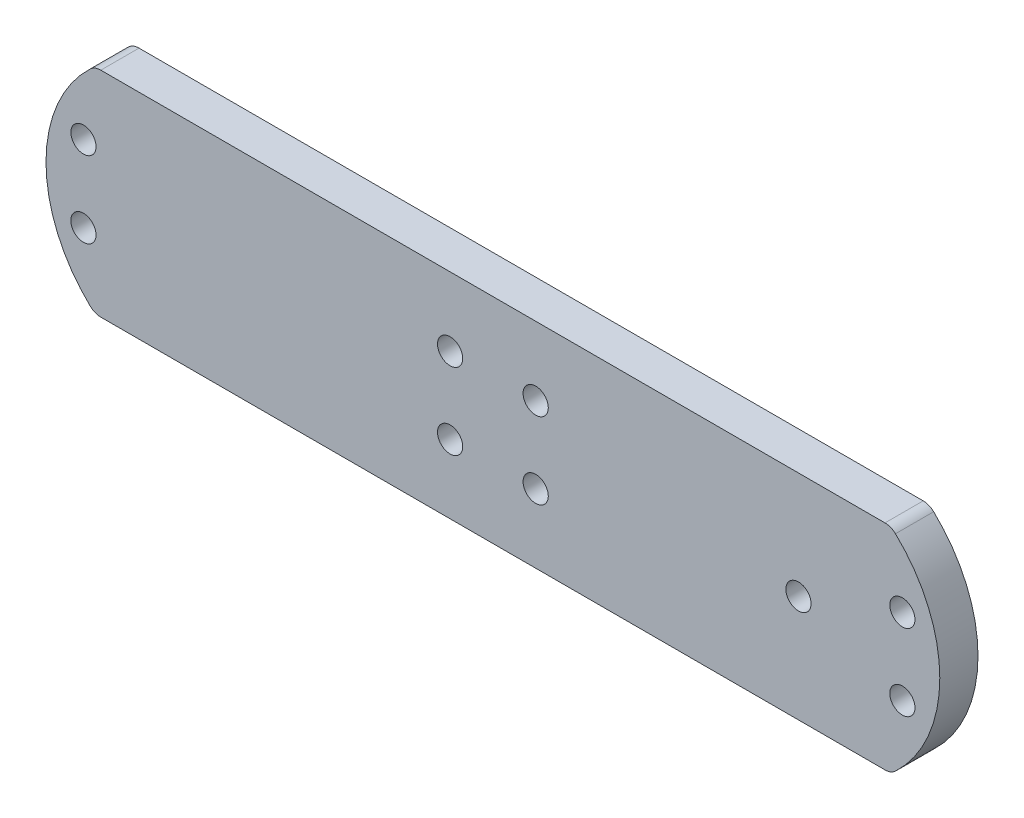
ISO-10303-21;
HEADER;
FILE_DESCRIPTION(('STEP AP214'),'2;1');
FILE_NAME('part.step','',(''),(''),'','','');
FILE_SCHEMA(('AUTOMOTIVE_DESIGN { 1 0 10303 214 1 1 1 1 }'));
ENDSEC;
DATA;
#1=APPLICATION_CONTEXT('core data for automotive mechanical design processes');
#2=APPLICATION_PROTOCOL_DEFINITION('international standard','automotive_design',2000,#1);
#3=PRODUCT_CONTEXT('',#1,'mechanical');
#4=PRODUCT('Part','Part','',(#3));
#5=PRODUCT_RELATED_PRODUCT_CATEGORY('part','',(#4));
#6=PRODUCT_DEFINITION_FORMATION('','',#4);
#7=PRODUCT_DEFINITION_CONTEXT('part definition',#1,'design');
#8=PRODUCT_DEFINITION('design','',#6,#7);
#9=PRODUCT_DEFINITION_SHAPE('','',#8);
#10=(LENGTH_UNIT() NAMED_UNIT(*) SI_UNIT(.MILLI.,.METRE.));
#11=(NAMED_UNIT(*) PLANE_ANGLE_UNIT() SI_UNIT($,.RADIAN.));
#12=(NAMED_UNIT(*) SI_UNIT($,.STERADIAN.) SOLID_ANGLE_UNIT());
#13=UNCERTAINTY_MEASURE_WITH_UNIT(LENGTH_MEASURE(1.E-05),#10,'distance_accuracy_value','');
#14=(GEOMETRIC_REPRESENTATION_CONTEXT(3) GLOBAL_UNCERTAINTY_ASSIGNED_CONTEXT((#13)) GLOBAL_UNIT_ASSIGNED_CONTEXT((#10,
#11,#12)) REPRESENTATION_CONTEXT('',''));
#15=CARTESIAN_POINT('',(0.,0.,0.));
#16=DIRECTION('',(0.,0.,1.));
#17=DIRECTION('',(1.,0.,0.));
#18=AXIS2_PLACEMENT_3D('',#15,#16,#17);
#19=CARTESIAN_POINT('',(11.3247516529062,-12.,5.));
#20=DIRECTION('',(0.,0.,-1.));
#21=DIRECTION('',(-1.,0.,0.));
#22=AXIS2_PLACEMENT_3D('',#19,#20,#21);
#23=CYLINDRICAL_SURFACE('',#22,2.00000000000001);
#24=CARTESIAN_POINT('',(11.3247516529062,-12.,0.));
#25=DIRECTION('',(0.,0.,1.));
#26=DIRECTION('',(1.,0.,0.));
#27=AXIS2_PLACEMENT_3D('',#24,#25,#26);
#28=CIRCLE('',#27,2.00000000000001);
#29=CARTESIAN_POINT('',(11.3247516529062,-14.,0.));
#30=VERTEX_POINT('',#29);
#31=CARTESIAN_POINT('',(12.6974488229554,-13.4545454545454,0.));
#32=VERTEX_POINT('',#31);
#33=EDGE_CURVE('E126',#30,#32,#28,.T.);
#34=ORIENTED_EDGE('',*,*,#33,.T.);
#35=DIRECTION('',(0.,0.,-1.));
#36=VECTOR('',#35,1.);
#37=CARTESIAN_POINT('',(12.6974488229554,-13.4545454545454,5.));
#38=LINE('',#37,#36);
#39=CARTESIAN_POINT('',(12.6974488229554,-13.4545454545454,5.));
#40=VERTEX_POINT('',#39);
#41=EDGE_CURVE('E11',#40,#32,#38,.T.);
#42=ORIENTED_EDGE('',*,*,#41,.F.);
#43=CARTESIAN_POINT('',(11.3247516529062,-12.,5.));
#44=DIRECTION('',(0.,0.,1.));
#45=DIRECTION('',(1.,0.,0.));
#46=AXIS2_PLACEMENT_3D('',#43,#44,#45);
#47=CIRCLE('',#46,2.00000000000001);
#48=CARTESIAN_POINT('',(11.3247516529062,-14.,5.));
#49=VERTEX_POINT('',#48);
#50=EDGE_CURVE('E141',#49,#40,#47,.T.);
#51=ORIENTED_EDGE('',*,*,#50,.F.);
#52=DIRECTION('',(0.,0.,-1.));
#53=VECTOR('',#52,1.);
#54=CARTESIAN_POINT('',(11.3247516529062,-14.,5.));
#55=LINE('',#54,#53);
#56=EDGE_CURVE('E122',#49,#30,#55,.T.);
#57=ORIENTED_EDGE('',*,*,#56,.T.);
#58=EDGE_LOOP('',(#34,#42,#51,#57));
#59=FACE_BOUND('',#58,.T.);
#60=ADVANCED_FACE('F30',(#59),#23,.T.);
#61=CARTESIAN_POINT('',(0.,0.,5.));
#62=DIRECTION('',(0.,0.,-1.));
#63=DIRECTION('',(-1.,0.,0.));
#64=AXIS2_PLACEMENT_3D('',#61,#62,#63);
#65=CYLINDRICAL_SURFACE('',#64,18.5);
#66=CARTESIAN_POINT('',(0.,0.,0.));
#67=DIRECTION('',(0.,0.,1.));
#68=DIRECTION('',(1.,0.,0.));
#69=AXIS2_PLACEMENT_3D('',#66,#67,#68);
#70=CIRCLE('',#69,18.5);
#71=CARTESIAN_POINT('',(12.6974488229554,13.4545454545455,0.));
#72=VERTEX_POINT('',#71);
#73=EDGE_CURVE('E129',#32,#72,#70,.T.);
#74=ORIENTED_EDGE('',*,*,#73,.T.);
#75=DIRECTION('',(0.,0.,-1.));
#76=VECTOR('',#75,1.);
#77=CARTESIAN_POINT('',(12.6974488229554,13.4545454545455,5.));
#78=LINE('',#77,#76);
#79=CARTESIAN_POINT('',(12.6974488229554,13.4545454545455,5.));
#80=VERTEX_POINT('',#79);
#81=EDGE_CURVE('E38',#80,#72,#78,.T.);
#82=ORIENTED_EDGE('',*,*,#81,.F.);
#83=CARTESIAN_POINT('',(0.,0.,5.));
#84=DIRECTION('',(0.,0.,1.));
#85=DIRECTION('',(1.,0.,0.));
#86=AXIS2_PLACEMENT_3D('',#83,#84,#85);
#87=CIRCLE('',#86,18.5);
#88=EDGE_CURVE('E89',#40,#80,#87,.T.);
#89=ORIENTED_EDGE('',*,*,#88,.F.);
#90=ORIENTED_EDGE('',*,*,#41,.T.);
#91=EDGE_LOOP('',(#74,#82,#89,#90));
#92=FACE_BOUND('',#91,.T.);
#93=ADVANCED_FACE('F266',(#92),#65,.T.);
#94=CARTESIAN_POINT('',(11.3247516529062,12.,5.));
#95=DIRECTION('',(0.,0.,-1.));
#96=DIRECTION('',(-1.,0.,0.));
#97=AXIS2_PLACEMENT_3D('',#94,#95,#96);
#98=CYLINDRICAL_SURFACE('',#97,2.);
#99=CARTESIAN_POINT('',(11.3247516529062,12.,0.));
#100=DIRECTION('',(0.,0.,1.));
#101=DIRECTION('',(1.,0.,0.));
#102=AXIS2_PLACEMENT_3D('',#99,#100,#101);
#103=CIRCLE('',#102,2.);
#104=CARTESIAN_POINT('',(11.3247516529062,14.,0.));
#105=VERTEX_POINT('',#104);
#106=EDGE_CURVE('E132',#72,#105,#103,.T.);
#107=ORIENTED_EDGE('',*,*,#106,.T.);
#108=DIRECTION('',(0.,0.,-1.));
#109=VECTOR('',#108,1.);
#110=CARTESIAN_POINT('',(11.3247516529062,14.,5.));
#111=LINE('',#110,#109);
#112=CARTESIAN_POINT('',(11.3247516529062,14.,5.));
#113=VERTEX_POINT('',#112);
#114=EDGE_CURVE('E148',#113,#105,#111,.T.);
#115=ORIENTED_EDGE('',*,*,#114,.F.);
#116=CARTESIAN_POINT('',(11.3247516529062,12.,5.));
#117=DIRECTION('',(0.,0.,1.));
#118=DIRECTION('',(1.,0.,0.));
#119=AXIS2_PLACEMENT_3D('',#116,#117,#118);
#120=CIRCLE('',#119,2.);
#121=EDGE_CURVE('E156',#80,#113,#120,.T.);
#122=ORIENTED_EDGE('',*,*,#121,.F.);
#123=ORIENTED_EDGE('',*,*,#81,.T.);
#124=EDGE_LOOP('',(#107,#115,#122,#123));
#125=FACE_BOUND('',#124,.T.);
#126=ADVANCED_FACE('F154',(#125),#98,.T.);
#127=CARTESIAN_POINT('',(-91.3247516529061,14.0000000000001,5.));
#128=DIRECTION('',(0.,-1.,0.));
#129=DIRECTION('',(1.,0.,0.));
#130=AXIS2_PLACEMENT_3D('',#127,#128,#129);
#131=PLANE('',#130);
#132=DIRECTION('',(-1.,0.,0.));
#133=VECTOR('',#132,1.);
#134=CARTESIAN_POINT('',(-91.3247516529061,14.0000000000001,0.));
#135=LINE('',#134,#133);
#136=CARTESIAN_POINT('',(-91.3247516529061,14.,0.));
#137=VERTEX_POINT('',#136);
#138=EDGE_CURVE('E134',#105,#137,#135,.T.);
#139=ORIENTED_EDGE('',*,*,#138,.T.);
#140=DIRECTION('',(0.,0.,-1.));
#141=VECTOR('',#140,1.);
#142=CARTESIAN_POINT('',(-91.3247516529061,14.,5.));
#143=LINE('',#142,#141);
#144=CARTESIAN_POINT('',(-91.3247516529061,14.,5.));
#145=VERTEX_POINT('',#144);
#146=EDGE_CURVE('E145',#145,#137,#143,.T.);
#147=ORIENTED_EDGE('',*,*,#146,.F.);
#148=DIRECTION('',(-1.,0.,0.));
#149=VECTOR('',#148,1.);
#150=CARTESIAN_POINT('',(-91.3247516529061,14.0000000000001,5.));
#151=LINE('',#150,#149);
#152=EDGE_CURVE('E168',#113,#145,#151,.T.);
#153=ORIENTED_EDGE('',*,*,#152,.F.);
#154=ORIENTED_EDGE('',*,*,#114,.T.);
#155=EDGE_LOOP('',(#139,#147,#153,#154));
#156=FACE_BOUND('',#155,.T.);
#157=ADVANCED_FACE('F164',(#156),#131,.F.);
#158=CARTESIAN_POINT('',(-91.3247516529061,12.0000000000001,5.));
#159=DIRECTION('',(0.,0.,-1.));
#160=DIRECTION('',(-1.,0.,0.));
#161=AXIS2_PLACEMENT_3D('',#158,#159,#160);
#162=CYLINDRICAL_SURFACE('',#161,1.99999999999999);
#163=CARTESIAN_POINT('',(-91.3247516529061,12.0000000000001,0.));
#164=DIRECTION('',(0.,0.,1.));
#165=DIRECTION('',(1.,0.,0.));
#166=AXIS2_PLACEMENT_3D('',#163,#164,#165);
#167=CIRCLE('',#166,1.99999999999999);
#168=CARTESIAN_POINT('',(-92.6974488229553,13.4545454545455,0.));
#169=VERTEX_POINT('',#168);
#170=EDGE_CURVE('E136',#137,#169,#167,.T.);
#171=ORIENTED_EDGE('',*,*,#170,.T.);
#172=DIRECTION('',(0.,0.,-1.));
#173=VECTOR('',#172,1.);
#174=CARTESIAN_POINT('',(-92.6974488229553,13.4545454545455,5.));
#175=LINE('',#174,#173);
#176=CARTESIAN_POINT('',(-92.6974488229553,13.4545454545455,5.));
#177=VERTEX_POINT('',#176);
#178=EDGE_CURVE('E117',#177,#169,#175,.T.);
#179=ORIENTED_EDGE('',*,*,#178,.F.);
#180=CARTESIAN_POINT('',(-91.3247516529061,12.0000000000001,5.));
#181=DIRECTION('',(0.,0.,1.));
#182=DIRECTION('',(1.,0.,0.));
#183=AXIS2_PLACEMENT_3D('',#180,#181,#182);
#184=CIRCLE('',#183,1.99999999999999);
#185=EDGE_CURVE('E108',#145,#177,#184,.T.);
#186=ORIENTED_EDGE('',*,*,#185,.F.);
#187=ORIENTED_EDGE('',*,*,#146,.T.);
#188=EDGE_LOOP('',(#171,#179,#186,#187));
#189=FACE_BOUND('',#188,.T.);
#190=ADVANCED_FACE('F167',(#189),#162,.T.);
#191=CARTESIAN_POINT('',(-79.9999999999999,0.,5.));
#192=DIRECTION('',(0.,0.,-1.));
#193=DIRECTION('',(-1.,0.,0.));
#194=AXIS2_PLACEMENT_3D('',#191,#192,#193);
#195=CYLINDRICAL_SURFACE('',#194,18.5);
#196=CARTESIAN_POINT('',(-79.9999999999999,0.,0.));
#197=DIRECTION('',(0.,0.,1.));
#198=DIRECTION('',(1.,0.,0.));
#199=AXIS2_PLACEMENT_3D('',#196,#197,#198);
#200=CIRCLE('',#199,18.5);
#201=CARTESIAN_POINT('',(-92.6974488229554,-13.4545454545454,0.));
#202=VERTEX_POINT('',#201);
#203=EDGE_CURVE('E116',#169,#202,#200,.T.);
#204=ORIENTED_EDGE('',*,*,#203,.T.);
#205=DIRECTION('',(0.,0.,-1.));
#206=VECTOR('',#205,1.);
#207=CARTESIAN_POINT('',(-92.6974488229554,-13.4545454545454,5.));
#208=LINE('',#207,#206);
#209=CARTESIAN_POINT('',(-92.6974488229554,-13.4545454545454,5.));
#210=VERTEX_POINT('',#209);
#211=EDGE_CURVE('E113',#210,#202,#208,.T.);
#212=ORIENTED_EDGE('',*,*,#211,.F.);
#213=CARTESIAN_POINT('',(-79.9999999999999,0.,5.));
#214=DIRECTION('',(0.,0.,1.));
#215=DIRECTION('',(1.,0.,0.));
#216=AXIS2_PLACEMENT_3D('',#213,#214,#215);
#217=CIRCLE('',#216,18.5);
#218=EDGE_CURVE('E102',#177,#210,#217,.T.);
#219=ORIENTED_EDGE('',*,*,#218,.F.);
#220=ORIENTED_EDGE('',*,*,#178,.T.);
#221=EDGE_LOOP('',(#204,#212,#219,#220));
#222=FACE_BOUND('',#221,.T.);
#223=ADVANCED_FACE('F114',(#222),#195,.T.);
#224=CARTESIAN_POINT('',(-91.3247516529061,-11.9999999999999,5.));
#225=DIRECTION('',(0.,0.,-1.));
#226=DIRECTION('',(-1.,0.,0.));
#227=AXIS2_PLACEMENT_3D('',#224,#225,#226);
#228=CYLINDRICAL_SURFACE('',#227,2.00000000000001);
#229=CARTESIAN_POINT('',(-91.3247516529061,-11.9999999999999,0.));
#230=DIRECTION('',(0.,0.,1.));
#231=DIRECTION('',(1.,0.,0.));
#232=AXIS2_PLACEMENT_3D('',#229,#230,#231);
#233=CIRCLE('',#232,2.00000000000001);
#234=CARTESIAN_POINT('',(-91.3247516529061,-13.9999999999999,0.));
#235=VERTEX_POINT('',#234);
#236=EDGE_CURVE('E75',#202,#235,#233,.T.);
#237=ORIENTED_EDGE('',*,*,#236,.T.);
#238=DIRECTION('',(0.,0.,-1.));
#239=VECTOR('',#238,1.);
#240=CARTESIAN_POINT('',(-91.3247516529061,-13.9999999999999,5.));
#241=LINE('',#240,#239);
#242=CARTESIAN_POINT('',(-91.3247516529061,-13.9999999999999,5.));
#243=VERTEX_POINT('',#242);
#244=EDGE_CURVE('E118',#243,#235,#241,.T.);
#245=ORIENTED_EDGE('',*,*,#244,.F.);
#246=CARTESIAN_POINT('',(-91.3247516529061,-11.9999999999999,5.));
#247=DIRECTION('',(0.,0.,1.));
#248=DIRECTION('',(1.,0.,0.));
#249=AXIS2_PLACEMENT_3D('',#246,#247,#248);
#250=CIRCLE('',#249,2.00000000000001);
#251=EDGE_CURVE('E106',#210,#243,#250,.T.);
#252=ORIENTED_EDGE('',*,*,#251,.F.);
#253=ORIENTED_EDGE('',*,*,#211,.T.);
#254=EDGE_LOOP('',(#237,#245,#252,#253));
#255=FACE_BOUND('',#254,.T.);
#256=ADVANCED_FACE('F120',(#255),#228,.T.);
#257=CARTESIAN_POINT('',(11.3247516529062,-14.,5.));
#258=DIRECTION('',(0.,1.,0.));
#259=DIRECTION('',(-1.,0.,0.));
#260=AXIS2_PLACEMENT_3D('',#257,#258,#259);
#261=PLANE('',#260);
#262=DIRECTION('',(1.,0.,0.));
#263=VECTOR('',#262,1.);
#264=CARTESIAN_POINT('',(11.3247516529062,-14.,0.));
#265=LINE('',#264,#263);
#266=EDGE_CURVE('E81',#235,#30,#265,.T.);
#267=ORIENTED_EDGE('',*,*,#266,.T.);
#268=ORIENTED_EDGE('',*,*,#56,.F.);
#269=DIRECTION('',(1.,0.,0.));
#270=VECTOR('',#269,1.);
#271=CARTESIAN_POINT('',(11.3247516529062,-14.,5.));
#272=LINE('',#271,#270);
#273=EDGE_CURVE('E46',#243,#49,#272,.T.);
#274=ORIENTED_EDGE('',*,*,#273,.F.);
#275=ORIENTED_EDGE('',*,*,#244,.T.);
#276=EDGE_LOOP('',(#267,#268,#274,#275));
#277=FACE_BOUND('',#276,.T.);
#278=ADVANCED_FACE('F257',(#277),#261,.F.);
#279=CARTESIAN_POINT('',(11.3247516529062,-12.,5.));
#280=DIRECTION('',(0.,0.,1.));
#281=DIRECTION('',(1.,0.,0.));
#282=AXIS2_PLACEMENT_3D('',#279,#280,#281);
#283=PLANE('',#282);
#284=CARTESIAN_POINT('',(0.,0.,5.));
#285=DIRECTION('',(0.,0.,-1.));
#286=DIRECTION('',(-1.,0.,0.));
#287=AXIS2_PLACEMENT_3D('',#284,#285,#286);
#288=CIRCLE('',#287,1.64999999999997);
#289=CARTESIAN_POINT('',(-1.64999999999993,0.,5.));
#290=VERTEX_POINT('',#289);
#291=EDGE_CURVE('E221',#290,#290,#288,.T.);
#292=ORIENTED_EDGE('',*,*,#291,.T.);
#293=EDGE_LOOP('',(#292));
#294=FACE_BOUND('',#293,.T.);
#295=CARTESIAN_POINT('',(-93.6000000000008,-4.99999999999995,5.));
#296=DIRECTION('',(0.,0.,1.));
#297=DIRECTION('',(1.,0.,0.));
#298=AXIS2_PLACEMENT_3D('',#295,#296,#297);
#299=CIRCLE('',#298,1.65);
#300=CARTESIAN_POINT('',(-91.9500000000008,-4.99999999999995,5.));
#301=VERTEX_POINT('',#300);
#302=EDGE_CURVE('E218',#301,#301,#299,.T.);
#303=ORIENTED_EDGE('',*,*,#302,.F.);
#304=EDGE_LOOP('',(#303));
#305=FACE_BOUND('',#304,.T.);
#306=CARTESIAN_POINT('',(-93.6000000000008,5.00000000000005,5.));
#307=DIRECTION('',(0.,0.,1.));
#308=DIRECTION('',(1.,0.,0.));
#309=AXIS2_PLACEMENT_3D('',#306,#307,#308);
#310=CIRCLE('',#309,1.65);
#311=CARTESIAN_POINT('',(-91.9500000000008,5.00000000000005,5.));
#312=VERTEX_POINT('',#311);
#313=EDGE_CURVE('E212',#312,#312,#310,.T.);
#314=ORIENTED_EDGE('',*,*,#313,.F.);
#315=EDGE_LOOP('',(#314));
#316=FACE_BOUND('',#315,.T.);
#317=CARTESIAN_POINT('',(-45.6000000000008,-4.99999999999998,5.));
#318=DIRECTION('',(0.,0.,1.));
#319=DIRECTION('',(1.,0.,0.));
#320=AXIS2_PLACEMENT_3D('',#317,#318,#319);
#321=CIRCLE('',#320,1.65);
#322=CARTESIAN_POINT('',(-43.9500000000008,-4.99999999999998,5.));
#323=VERTEX_POINT('',#322);
#324=EDGE_CURVE('E206',#323,#323,#321,.T.);
#325=ORIENTED_EDGE('',*,*,#324,.F.);
#326=EDGE_LOOP('',(#325));
#327=FACE_BOUND('',#326,.T.);
#328=CARTESIAN_POINT('',(-45.6000000000008,5.00000000000005,5.));
#329=DIRECTION('',(0.,0.,1.));
#330=DIRECTION('',(1.,0.,0.));
#331=AXIS2_PLACEMENT_3D('',#328,#329,#330);
#332=CIRCLE('',#331,1.65);
#333=CARTESIAN_POINT('',(-43.9500000000008,5.00000000000005,5.));
#334=VERTEX_POINT('',#333);
#335=EDGE_CURVE('E200',#334,#334,#332,.T.);
#336=ORIENTED_EDGE('',*,*,#335,.F.);
#337=EDGE_LOOP('',(#336));
#338=FACE_BOUND('',#337,.T.);
#339=CARTESIAN_POINT('',(-34.4,-4.99999999999997,5.));
#340=DIRECTION('',(0.,0.,1.));
#341=DIRECTION('',(1.,0.,0.));
#342=AXIS2_PLACEMENT_3D('',#339,#340,#341);
#343=CIRCLE('',#342,1.65);
#344=CARTESIAN_POINT('',(-32.75,-4.99999999999997,5.));
#345=VERTEX_POINT('',#344);
#346=EDGE_CURVE('E194',#345,#345,#343,.T.);
#347=ORIENTED_EDGE('',*,*,#346,.F.);
#348=EDGE_LOOP('',(#347));
#349=FACE_BOUND('',#348,.T.);
#350=CARTESIAN_POINT('',(-34.4,5.00000000000006,5.));
#351=DIRECTION('',(0.,0.,1.));
#352=DIRECTION('',(1.,0.,0.));
#353=AXIS2_PLACEMENT_3D('',#350,#351,#352);
#354=CIRCLE('',#353,1.65);
#355=CARTESIAN_POINT('',(-32.75,5.00000000000006,5.));
#356=VERTEX_POINT('',#355);
#357=EDGE_CURVE('E188',#356,#356,#354,.T.);
#358=ORIENTED_EDGE('',*,*,#357,.F.);
#359=EDGE_LOOP('',(#358));
#360=FACE_BOUND('',#359,.T.);
#361=CARTESIAN_POINT('',(13.6,-4.99999999999999,5.));
#362=DIRECTION('',(0.,0.,1.));
#363=DIRECTION('',(1.,0.,0.));
#364=AXIS2_PLACEMENT_3D('',#361,#362,#363);
#365=CIRCLE('',#364,1.65);
#366=CARTESIAN_POINT('',(15.25,-4.99999999999999,5.));
#367=VERTEX_POINT('',#366);
#368=EDGE_CURVE('E182',#367,#367,#365,.T.);
#369=ORIENTED_EDGE('',*,*,#368,.F.);
#370=EDGE_LOOP('',(#369));
#371=FACE_BOUND('',#370,.T.);
#372=CARTESIAN_POINT('',(13.6,5.00000000000002,5.));
#373=DIRECTION('',(0.,0.,1.));
#374=DIRECTION('',(1.,0.,0.));
#375=AXIS2_PLACEMENT_3D('',#372,#373,#374);
#376=CIRCLE('',#375,1.65);
#377=CARTESIAN_POINT('',(15.25,5.00000000000002,5.));
#378=VERTEX_POINT('',#377);
#379=EDGE_CURVE('E176',#378,#378,#376,.T.);
#380=ORIENTED_EDGE('',*,*,#379,.F.);
#381=EDGE_LOOP('',(#380));
#382=FACE_BOUND('',#381,.T.);
#383=ORIENTED_EDGE('',*,*,#50,.T.);
#384=ORIENTED_EDGE('',*,*,#88,.T.);
#385=ORIENTED_EDGE('',*,*,#121,.T.);
#386=ORIENTED_EDGE('',*,*,#152,.T.);
#387=ORIENTED_EDGE('',*,*,#185,.T.);
#388=ORIENTED_EDGE('',*,*,#218,.T.);
#389=ORIENTED_EDGE('',*,*,#251,.T.);
#390=ORIENTED_EDGE('',*,*,#273,.T.);
#391=EDGE_LOOP('',(#383,#384,#385,#386,#387,#388,#389,#390));
#392=FACE_BOUND('',#391,.T.);
#393=ADVANCED_FACE('F104',(#294,#305,#316,#327,#338,#349,#360,#371,#382,#392),#283,.T.);
#394=CARTESIAN_POINT('',(11.3247516529062,-12.,0.));
#395=DIRECTION('',(0.,0.,1.));
#396=DIRECTION('',(1.,0.,0.));
#397=AXIS2_PLACEMENT_3D('',#394,#395,#396);
#398=PLANE('',#397);
#399=CARTESIAN_POINT('',(0.,0.,0.));
#400=DIRECTION('',(0.,0.,-1.));
#401=DIRECTION('',(-1.,0.,0.));
#402=AXIS2_PLACEMENT_3D('',#399,#400,#401);
#403=CIRCLE('',#402,1.64999999999997);
#404=CARTESIAN_POINT('',(-1.64999999999993,0.,0.));
#405=VERTEX_POINT('',#404);
#406=EDGE_CURVE('E224',#405,#405,#403,.T.);
#407=ORIENTED_EDGE('',*,*,#406,.F.);
#408=EDGE_LOOP('',(#407));
#409=FACE_BOUND('',#408,.T.);
#410=CARTESIAN_POINT('',(-93.6000000000008,-4.99999999999995,0.));
#411=DIRECTION('',(0.,0.,1.));
#412=DIRECTION('',(1.,0.,0.));
#413=AXIS2_PLACEMENT_3D('',#410,#411,#412);
#414=CIRCLE('',#413,1.65);
#415=CARTESIAN_POINT('',(-91.9500000000008,-4.99999999999995,0.));
#416=VERTEX_POINT('',#415);
#417=EDGE_CURVE('E215',#416,#416,#414,.T.);
#418=ORIENTED_EDGE('',*,*,#417,.T.);
#419=EDGE_LOOP('',(#418));
#420=FACE_BOUND('',#419,.T.);
#421=CARTESIAN_POINT('',(-93.6000000000008,5.00000000000005,0.));
#422=DIRECTION('',(0.,0.,1.));
#423=DIRECTION('',(1.,0.,0.));
#424=AXIS2_PLACEMENT_3D('',#421,#422,#423);
#425=CIRCLE('',#424,1.65);
#426=CARTESIAN_POINT('',(-91.9500000000008,5.00000000000005,0.));
#427=VERTEX_POINT('',#426);
#428=EDGE_CURVE('E209',#427,#427,#425,.T.);
#429=ORIENTED_EDGE('',*,*,#428,.T.);
#430=EDGE_LOOP('',(#429));
#431=FACE_BOUND('',#430,.T.);
#432=CARTESIAN_POINT('',(-45.6000000000008,-4.99999999999998,0.));
#433=DIRECTION('',(0.,0.,1.));
#434=DIRECTION('',(1.,0.,0.));
#435=AXIS2_PLACEMENT_3D('',#432,#433,#434);
#436=CIRCLE('',#435,1.65);
#437=CARTESIAN_POINT('',(-43.9500000000008,-4.99999999999998,0.));
#438=VERTEX_POINT('',#437);
#439=EDGE_CURVE('E203',#438,#438,#436,.T.);
#440=ORIENTED_EDGE('',*,*,#439,.T.);
#441=EDGE_LOOP('',(#440));
#442=FACE_BOUND('',#441,.T.);
#443=CARTESIAN_POINT('',(-45.6000000000008,5.00000000000005,0.));
#444=DIRECTION('',(0.,0.,1.));
#445=DIRECTION('',(1.,0.,0.));
#446=AXIS2_PLACEMENT_3D('',#443,#444,#445);
#447=CIRCLE('',#446,1.65);
#448=CARTESIAN_POINT('',(-43.9500000000008,5.00000000000005,0.));
#449=VERTEX_POINT('',#448);
#450=EDGE_CURVE('E197',#449,#449,#447,.T.);
#451=ORIENTED_EDGE('',*,*,#450,.T.);
#452=EDGE_LOOP('',(#451));
#453=FACE_BOUND('',#452,.T.);
#454=CARTESIAN_POINT('',(-34.4,-4.99999999999997,0.));
#455=DIRECTION('',(0.,0.,1.));
#456=DIRECTION('',(1.,0.,0.));
#457=AXIS2_PLACEMENT_3D('',#454,#455,#456);
#458=CIRCLE('',#457,1.65);
#459=CARTESIAN_POINT('',(-32.75,-4.99999999999997,0.));
#460=VERTEX_POINT('',#459);
#461=EDGE_CURVE('E191',#460,#460,#458,.T.);
#462=ORIENTED_EDGE('',*,*,#461,.T.);
#463=EDGE_LOOP('',(#462));
#464=FACE_BOUND('',#463,.T.);
#465=CARTESIAN_POINT('',(-34.4,5.00000000000006,0.));
#466=DIRECTION('',(0.,0.,1.));
#467=DIRECTION('',(1.,0.,0.));
#468=AXIS2_PLACEMENT_3D('',#465,#466,#467);
#469=CIRCLE('',#468,1.65);
#470=CARTESIAN_POINT('',(-32.75,5.00000000000006,0.));
#471=VERTEX_POINT('',#470);
#472=EDGE_CURVE('E185',#471,#471,#469,.T.);
#473=ORIENTED_EDGE('',*,*,#472,.T.);
#474=EDGE_LOOP('',(#473));
#475=FACE_BOUND('',#474,.T.);
#476=CARTESIAN_POINT('',(13.6,-4.99999999999999,0.));
#477=DIRECTION('',(0.,0.,1.));
#478=DIRECTION('',(1.,0.,0.));
#479=AXIS2_PLACEMENT_3D('',#476,#477,#478);
#480=CIRCLE('',#479,1.65);
#481=CARTESIAN_POINT('',(15.25,-4.99999999999999,0.));
#482=VERTEX_POINT('',#481);
#483=EDGE_CURVE('E179',#482,#482,#480,.T.);
#484=ORIENTED_EDGE('',*,*,#483,.T.);
#485=EDGE_LOOP('',(#484));
#486=FACE_BOUND('',#485,.T.);
#487=CARTESIAN_POINT('',(13.6,5.00000000000002,0.));
#488=DIRECTION('',(0.,0.,1.));
#489=DIRECTION('',(1.,0.,0.));
#490=AXIS2_PLACEMENT_3D('',#487,#488,#489);
#491=CIRCLE('',#490,1.65);
#492=CARTESIAN_POINT('',(15.25,5.00000000000002,0.));
#493=VERTEX_POINT('',#492);
#494=EDGE_CURVE('E130',#493,#493,#491,.T.);
#495=ORIENTED_EDGE('',*,*,#494,.T.);
#496=EDGE_LOOP('',(#495));
#497=FACE_BOUND('',#496,.T.);
#498=ORIENTED_EDGE('',*,*,#33,.F.);
#499=ORIENTED_EDGE('',*,*,#266,.F.);
#500=ORIENTED_EDGE('',*,*,#236,.F.);
#501=ORIENTED_EDGE('',*,*,#203,.F.);
#502=ORIENTED_EDGE('',*,*,#170,.F.);
#503=ORIENTED_EDGE('',*,*,#138,.F.);
#504=ORIENTED_EDGE('',*,*,#106,.F.);
#505=ORIENTED_EDGE('',*,*,#73,.F.);
#506=EDGE_LOOP('',(#498,#499,#500,#501,#502,#503,#504,#505));
#507=FACE_BOUND('',#506,.T.);
#508=ADVANCED_FACE('F160',(#409,#420,#431,#442,#453,#464,#475,#486,#497,#507),#398,.F.);
#509=CARTESIAN_POINT('',(13.6,5.00000000000002,5.));
#510=DIRECTION('',(0.,0.,1.));
#511=DIRECTION('',(1.,0.,0.));
#512=AXIS2_PLACEMENT_3D('',#509,#510,#511);
#513=CYLINDRICAL_SURFACE('',#512,1.65);
#514=ORIENTED_EDGE('',*,*,#494,.F.);
#515=EDGE_LOOP('',(#514));
#516=FACE_BOUND('',#515,.T.);
#517=ORIENTED_EDGE('',*,*,#379,.T.);
#518=EDGE_LOOP('',(#517));
#519=FACE_BOUND('',#518,.T.);
#520=ADVANCED_FACE('F232',(#516,#519),#513,.F.);
#521=CARTESIAN_POINT('',(13.6,-4.99999999999999,5.));
#522=DIRECTION('',(0.,0.,1.));
#523=DIRECTION('',(1.,0.,0.));
#524=AXIS2_PLACEMENT_3D('',#521,#522,#523);
#525=CYLINDRICAL_SURFACE('',#524,1.65);
#526=ORIENTED_EDGE('',*,*,#483,.F.);
#527=EDGE_LOOP('',(#526));
#528=FACE_BOUND('',#527,.T.);
#529=ORIENTED_EDGE('',*,*,#368,.T.);
#530=EDGE_LOOP('',(#529));
#531=FACE_BOUND('',#530,.T.);
#532=ADVANCED_FACE('F252',(#528,#531),#525,.F.);
#533=CARTESIAN_POINT('',(-34.4,5.00000000000006,5.));
#534=DIRECTION('',(0.,0.,1.));
#535=DIRECTION('',(1.,0.,0.));
#536=AXIS2_PLACEMENT_3D('',#533,#534,#535);
#537=CYLINDRICAL_SURFACE('',#536,1.65);
#538=ORIENTED_EDGE('',*,*,#472,.F.);
#539=EDGE_LOOP('',(#538));
#540=FACE_BOUND('',#539,.T.);
#541=ORIENTED_EDGE('',*,*,#357,.T.);
#542=EDGE_LOOP('',(#541));
#543=FACE_BOUND('',#542,.T.);
#544=ADVANCED_FACE('F310',(#540,#543),#537,.F.);
#545=CARTESIAN_POINT('',(-34.4,-4.99999999999997,5.));
#546=DIRECTION('',(0.,0.,1.));
#547=DIRECTION('',(1.,0.,0.));
#548=AXIS2_PLACEMENT_3D('',#545,#546,#547);
#549=CYLINDRICAL_SURFACE('',#548,1.65);
#550=ORIENTED_EDGE('',*,*,#461,.F.);
#551=EDGE_LOOP('',(#550));
#552=FACE_BOUND('',#551,.T.);
#553=ORIENTED_EDGE('',*,*,#346,.T.);
#554=EDGE_LOOP('',(#553));
#555=FACE_BOUND('',#554,.T.);
#556=ADVANCED_FACE('F320',(#552,#555),#549,.F.);
#557=CARTESIAN_POINT('',(-45.6000000000008,5.00000000000005,5.));
#558=DIRECTION('',(0.,0.,1.));
#559=DIRECTION('',(1.,0.,0.));
#560=AXIS2_PLACEMENT_3D('',#557,#558,#559);
#561=CYLINDRICAL_SURFACE('',#560,1.65);
#562=ORIENTED_EDGE('',*,*,#450,.F.);
#563=EDGE_LOOP('',(#562));
#564=FACE_BOUND('',#563,.T.);
#565=ORIENTED_EDGE('',*,*,#335,.T.);
#566=EDGE_LOOP('',(#565));
#567=FACE_BOUND('',#566,.T.);
#568=ADVANCED_FACE('F330',(#564,#567),#561,.F.);
#569=CARTESIAN_POINT('',(-45.6000000000008,-4.99999999999998,5.));
#570=DIRECTION('',(0.,0.,1.));
#571=DIRECTION('',(1.,0.,0.));
#572=AXIS2_PLACEMENT_3D('',#569,#570,#571);
#573=CYLINDRICAL_SURFACE('',#572,1.65);
#574=ORIENTED_EDGE('',*,*,#439,.F.);
#575=EDGE_LOOP('',(#574));
#576=FACE_BOUND('',#575,.T.);
#577=ORIENTED_EDGE('',*,*,#324,.T.);
#578=EDGE_LOOP('',(#577));
#579=FACE_BOUND('',#578,.T.);
#580=ADVANCED_FACE('F340',(#576,#579),#573,.F.);
#581=CARTESIAN_POINT('',(-93.6000000000008,5.00000000000005,5.));
#582=DIRECTION('',(0.,0.,1.));
#583=DIRECTION('',(1.,0.,0.));
#584=AXIS2_PLACEMENT_3D('',#581,#582,#583);
#585=CYLINDRICAL_SURFACE('',#584,1.65);
#586=ORIENTED_EDGE('',*,*,#428,.F.);
#587=EDGE_LOOP('',(#586));
#588=FACE_BOUND('',#587,.T.);
#589=ORIENTED_EDGE('',*,*,#313,.T.);
#590=EDGE_LOOP('',(#589));
#591=FACE_BOUND('',#590,.T.);
#592=ADVANCED_FACE('F350',(#588,#591),#585,.F.);
#593=CARTESIAN_POINT('',(-93.6000000000008,-4.99999999999995,5.));
#594=DIRECTION('',(0.,0.,1.));
#595=DIRECTION('',(1.,0.,0.));
#596=AXIS2_PLACEMENT_3D('',#593,#594,#595);
#597=CYLINDRICAL_SURFACE('',#596,1.65);
#598=ORIENTED_EDGE('',*,*,#417,.F.);
#599=EDGE_LOOP('',(#598));
#600=FACE_BOUND('',#599,.T.);
#601=ORIENTED_EDGE('',*,*,#302,.T.);
#602=EDGE_LOOP('',(#601));
#603=FACE_BOUND('',#602,.T.);
#604=ADVANCED_FACE('F360',(#600,#603),#597,.F.);
#605=CARTESIAN_POINT('',(0.,0.,0.));
#606=DIRECTION('',(0.,0.,-1.));
#607=DIRECTION('',(-1.,0.,0.));
#608=AXIS2_PLACEMENT_3D('',#605,#606,#607);
#609=CYLINDRICAL_SURFACE('',#608,1.64999999999997);
#610=ORIENTED_EDGE('',*,*,#291,.F.);
#611=EDGE_LOOP('',(#610));
#612=FACE_BOUND('',#611,.T.);
#613=ORIENTED_EDGE('',*,*,#406,.T.);
#614=EDGE_LOOP('',(#613));
#615=FACE_BOUND('',#614,.T.);
#616=ADVANCED_FACE('F228',(#612,#615),#609,.F.);
#617=CLOSED_SHELL('',(#60,#93,#126,#157,#190,#223,#256,#278,#393,#508,#520,#532,#544,#556,#568,
#580,#592,#604,#616));
#618=MANIFOLD_SOLID_BREP('B2',#617);
#619=ADVANCED_BREP_SHAPE_REPRESENTATION('',(#18,#618),#14);
#620=SHAPE_DEFINITION_REPRESENTATION(#9,#619);
ENDSEC;
END-ISO-10303-21;
